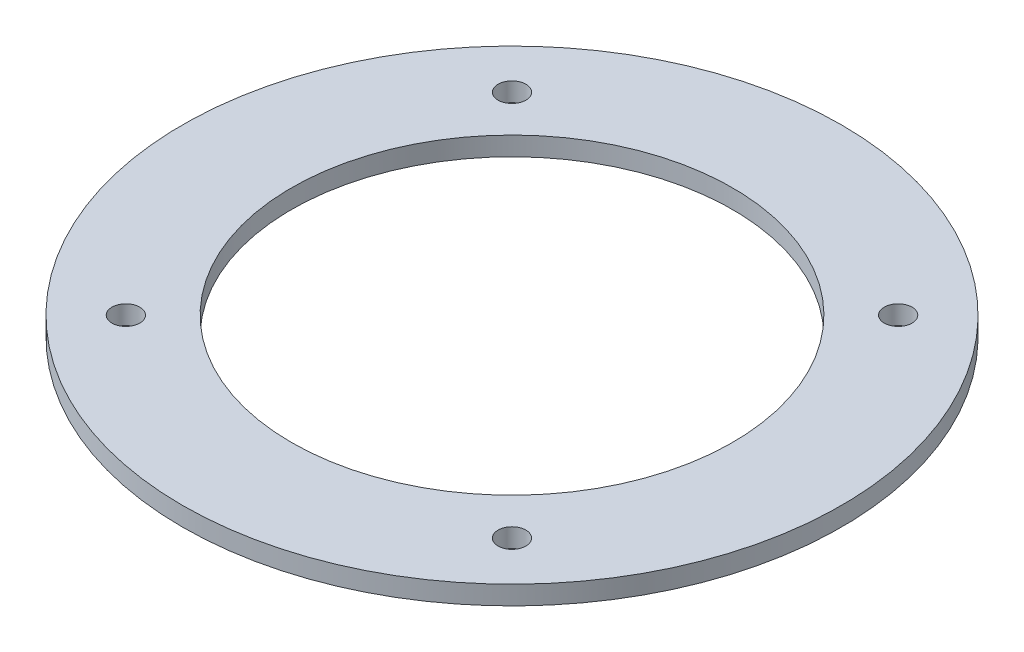
ISO-10303-21;
HEADER;
FILE_DESCRIPTION(('STEP AP214'),'2;1');
FILE_NAME('part.step','',(''),(''),'','','');
FILE_SCHEMA(('AUTOMOTIVE_DESIGN { 1 0 10303 214 1 1 1 1 }'));
ENDSEC;
DATA;
#1=APPLICATION_CONTEXT('core data for automotive mechanical design processes');
#2=APPLICATION_PROTOCOL_DEFINITION('international standard','automotive_design',2000,#1);
#3=PRODUCT_CONTEXT('',#1,'mechanical');
#4=PRODUCT('Part','Part','',(#3));
#5=PRODUCT_RELATED_PRODUCT_CATEGORY('part','',(#4));
#6=PRODUCT_DEFINITION_FORMATION('','',#4);
#7=PRODUCT_DEFINITION_CONTEXT('part definition',#1,'design');
#8=PRODUCT_DEFINITION('design','',#6,#7);
#9=PRODUCT_DEFINITION_SHAPE('','',#8);
#10=(LENGTH_UNIT() NAMED_UNIT(*) SI_UNIT(.MILLI.,.METRE.));
#11=(NAMED_UNIT(*) PLANE_ANGLE_UNIT() SI_UNIT($,.RADIAN.));
#12=(NAMED_UNIT(*) SI_UNIT($,.STERADIAN.) SOLID_ANGLE_UNIT());
#13=UNCERTAINTY_MEASURE_WITH_UNIT(LENGTH_MEASURE(1.E-05),#10,'distance_accuracy_value','');
#14=(GEOMETRIC_REPRESENTATION_CONTEXT(3) GLOBAL_UNCERTAINTY_ASSIGNED_CONTEXT((#13)) GLOBAL_UNIT_ASSIGNED_CONTEXT((#10,
#11,#12)) REPRESENTATION_CONTEXT('',''));
#15=CARTESIAN_POINT('',(0.,0.,0.));
#16=DIRECTION('',(0.,0.,1.));
#17=DIRECTION('',(1.,0.,0.));
#18=AXIS2_PLACEMENT_3D('',#15,#16,#17);
#19=CARTESIAN_POINT('',(0.,1.,0.));
#20=DIRECTION('',(0.,1.,0.));
#21=DIRECTION('',(0.,0.,1.));
#22=AXIS2_PLACEMENT_3D('',#19,#20,#21);
#23=PLANE('',#22);
#24=CARTESIAN_POINT('',(20.505,1.,20.505));
#25=DIRECTION('',(0.,1.,0.));
#26=DIRECTION('',(0.,0.,1.));
#27=AXIS2_PLACEMENT_3D('',#24,#25,#26);
#28=CIRCLE('',#27,1.475);
#29=CARTESIAN_POINT('',(20.505,1.,21.98));
#30=VERTEX_POINT('',#29);
#31=EDGE_CURVE('E64',#30,#30,#28,.T.);
#32=ORIENTED_EDGE('',*,*,#31,.F.);
#33=EDGE_LOOP('',(#32));
#34=FACE_BOUND('',#33,.T.);
#35=CARTESIAN_POINT('',(-20.505,1.,-20.505));
#36=DIRECTION('',(0.,1.,0.));
#37=DIRECTION('',(0.,0.,1.));
#38=AXIS2_PLACEMENT_3D('',#35,#36,#37);
#39=CIRCLE('',#38,1.475);
#40=CARTESIAN_POINT('',(-20.505,1.,-19.03));
#41=VERTEX_POINT('',#40);
#42=EDGE_CURVE('E52',#41,#41,#39,.T.);
#43=ORIENTED_EDGE('',*,*,#42,.F.);
#44=EDGE_LOOP('',(#43));
#45=FACE_BOUND('',#44,.T.);
#46=CARTESIAN_POINT('',(0.,1.,0.));
#47=DIRECTION('',(0.,1.,0.));
#48=DIRECTION('',(0.,0.,1.));
#49=AXIS2_PLACEMENT_3D('',#46,#47,#48);
#50=CIRCLE('',#49,35.);
#51=CARTESIAN_POINT('',(0.,1.,35.));
#52=VERTEX_POINT('',#51);
#53=EDGE_CURVE('E10',#52,#52,#50,.T.);
#54=ORIENTED_EDGE('',*,*,#53,.T.);
#55=EDGE_LOOP('',(#54));
#56=FACE_BOUND('',#55,.T.);
#57=CARTESIAN_POINT('',(0.,1.,0.));
#58=DIRECTION('',(0.,1.,0.));
#59=DIRECTION('',(0.,0.,1.));
#60=AXIS2_PLACEMENT_3D('',#57,#58,#59);
#61=CIRCLE('',#60,23.425);
#62=CARTESIAN_POINT('',(0.,1.,23.425));
#63=VERTEX_POINT('',#62);
#64=EDGE_CURVE('E47',#63,#63,#61,.T.);
#65=ORIENTED_EDGE('',*,*,#64,.F.);
#66=EDGE_LOOP('',(#65));
#67=FACE_BOUND('',#66,.T.);
#68=CARTESIAN_POINT('',(20.505,1.,-20.505));
#69=DIRECTION('',(0.,1.,0.));
#70=DIRECTION('',(0.,0.,-1.));
#71=AXIS2_PLACEMENT_3D('',#68,#69,#70);
#72=CIRCLE('',#71,1.475);
#73=CARTESIAN_POINT('',(20.505,1.,-21.98));
#74=VERTEX_POINT('',#73);
#75=EDGE_CURVE('E58',#74,#74,#72,.T.);
#76=ORIENTED_EDGE('',*,*,#75,.F.);
#77=EDGE_LOOP('',(#76));
#78=FACE_BOUND('',#77,.T.);
#79=CARTESIAN_POINT('',(-20.505,1.,20.505));
#80=DIRECTION('',(0.,1.,0.));
#81=DIRECTION('',(0.,0.,-1.));
#82=AXIS2_PLACEMENT_3D('',#79,#80,#81);
#83=CIRCLE('',#82,1.475);
#84=CARTESIAN_POINT('',(-20.505,1.,19.03));
#85=VERTEX_POINT('',#84);
#86=EDGE_CURVE('E70',#85,#85,#83,.T.);
#87=ORIENTED_EDGE('',*,*,#86,.F.);
#88=EDGE_LOOP('',(#87));
#89=FACE_BOUND('',#88,.T.);
#90=ADVANCED_FACE('F36',(#34,#45,#56,#67,#78,#89),#23,.T.);
#91=CARTESIAN_POINT('',(0.,-1.,0.));
#92=DIRECTION('',(0.,1.,0.));
#93=DIRECTION('',(0.,0.,1.));
#94=AXIS2_PLACEMENT_3D('',#91,#92,#93);
#95=PLANE('',#94);
#96=CARTESIAN_POINT('',(0.,-1.,0.));
#97=DIRECTION('',(0.,1.,0.));
#98=DIRECTION('',(0.,0.,1.));
#99=AXIS2_PLACEMENT_3D('',#96,#97,#98);
#100=CIRCLE('',#99,35.);
#101=CARTESIAN_POINT('',(0.,-1.,35.));
#102=VERTEX_POINT('',#101);
#103=EDGE_CURVE('E40',#102,#102,#100,.T.);
#104=ORIENTED_EDGE('',*,*,#103,.F.);
#105=EDGE_LOOP('',(#104));
#106=FACE_BOUND('',#105,.T.);
#107=CARTESIAN_POINT('',(0.,-1.,0.));
#108=DIRECTION('',(0.,1.,0.));
#109=DIRECTION('',(0.,0.,1.));
#110=AXIS2_PLACEMENT_3D('',#107,#108,#109);
#111=CIRCLE('',#110,23.425);
#112=CARTESIAN_POINT('',(0.,-1.,23.425));
#113=VERTEX_POINT('',#112);
#114=EDGE_CURVE('E49',#113,#113,#111,.T.);
#115=ORIENTED_EDGE('',*,*,#114,.T.);
#116=EDGE_LOOP('',(#115));
#117=FACE_BOUND('',#116,.T.);
#118=CARTESIAN_POINT('',(-20.505,-1.,-20.505));
#119=DIRECTION('',(0.,1.,0.));
#120=DIRECTION('',(0.,0.,1.));
#121=AXIS2_PLACEMENT_3D('',#118,#119,#120);
#122=CIRCLE('',#121,1.475);
#123=CARTESIAN_POINT('',(-20.505,-1.,-19.03));
#124=VERTEX_POINT('',#123);
#125=EDGE_CURVE('E55',#124,#124,#122,.T.);
#126=ORIENTED_EDGE('',*,*,#125,.T.);
#127=EDGE_LOOP('',(#126));
#128=FACE_BOUND('',#127,.T.);
#129=CARTESIAN_POINT('',(20.505,-1.,-20.505));
#130=DIRECTION('',(0.,1.,0.));
#131=DIRECTION('',(0.,0.,-1.));
#132=AXIS2_PLACEMENT_3D('',#129,#130,#131);
#133=CIRCLE('',#132,1.475);
#134=CARTESIAN_POINT('',(20.505,-1.,-21.98));
#135=VERTEX_POINT('',#134);
#136=EDGE_CURVE('E61',#135,#135,#133,.T.);
#137=ORIENTED_EDGE('',*,*,#136,.T.);
#138=EDGE_LOOP('',(#137));
#139=FACE_BOUND('',#138,.T.);
#140=CARTESIAN_POINT('',(20.505,-1.,20.505));
#141=DIRECTION('',(0.,1.,0.));
#142=DIRECTION('',(0.,0.,1.));
#143=AXIS2_PLACEMENT_3D('',#140,#141,#142);
#144=CIRCLE('',#143,1.475);
#145=CARTESIAN_POINT('',(20.505,-1.,21.98));
#146=VERTEX_POINT('',#145);
#147=EDGE_CURVE('E67',#146,#146,#144,.T.);
#148=ORIENTED_EDGE('',*,*,#147,.T.);
#149=EDGE_LOOP('',(#148));
#150=FACE_BOUND('',#149,.T.);
#151=CARTESIAN_POINT('',(-20.505,-1.,20.505));
#152=DIRECTION('',(0.,1.,0.));
#153=DIRECTION('',(0.,0.,-1.));
#154=AXIS2_PLACEMENT_3D('',#151,#152,#153);
#155=CIRCLE('',#154,1.475);
#156=CARTESIAN_POINT('',(-20.505,-1.,19.03));
#157=VERTEX_POINT('',#156);
#158=EDGE_CURVE('E73',#157,#157,#155,.T.);
#159=ORIENTED_EDGE('',*,*,#158,.T.);
#160=EDGE_LOOP('',(#159));
#161=FACE_BOUND('',#160,.T.);
#162=ADVANCED_FACE('F83',(#106,#117,#128,#139,#150,#161),#95,.F.);
#163=CARTESIAN_POINT('',(0.,1.,0.));
#164=DIRECTION('',(0.,-1.,0.));
#165=DIRECTION('',(0.,0.,-1.));
#166=AXIS2_PLACEMENT_3D('',#163,#164,#165);
#167=CYLINDRICAL_SURFACE('',#166,35.);
#168=ORIENTED_EDGE('',*,*,#53,.F.);
#169=EDGE_LOOP('',(#168));
#170=FACE_BOUND('',#169,.T.);
#171=ORIENTED_EDGE('',*,*,#103,.T.);
#172=EDGE_LOOP('',(#171));
#173=FACE_BOUND('',#172,.T.);
#174=ADVANCED_FACE('F38',(#170,#173),#167,.T.);
#175=CARTESIAN_POINT('',(0.,1.,0.));
#176=DIRECTION('',(0.,-1.,0.));
#177=DIRECTION('',(0.,0.,-1.));
#178=AXIS2_PLACEMENT_3D('',#175,#176,#177);
#179=CYLINDRICAL_SURFACE('',#178,23.425);
#180=ORIENTED_EDGE('',*,*,#64,.T.);
#181=EDGE_LOOP('',(#180));
#182=FACE_BOUND('',#181,.T.);
#183=ORIENTED_EDGE('',*,*,#114,.F.);
#184=EDGE_LOOP('',(#183));
#185=FACE_BOUND('',#184,.T.);
#186=ADVANCED_FACE('F93',(#182,#185),#179,.F.);
#187=CARTESIAN_POINT('',(-20.505,1.,-20.505));
#188=DIRECTION('',(0.,-1.,0.));
#189=DIRECTION('',(0.,0.,-1.));
#190=AXIS2_PLACEMENT_3D('',#187,#188,#189);
#191=CYLINDRICAL_SURFACE('',#190,1.475);
#192=ORIENTED_EDGE('',*,*,#42,.T.);
#193=EDGE_LOOP('',(#192));
#194=FACE_BOUND('',#193,.T.);
#195=ORIENTED_EDGE('',*,*,#125,.F.);
#196=EDGE_LOOP('',(#195));
#197=FACE_BOUND('',#196,.T.);
#198=ADVANCED_FACE('F96',(#194,#197),#191,.F.);
#199=CARTESIAN_POINT('',(20.505,1.,-20.505));
#200=DIRECTION('',(0.,-1.,0.));
#201=DIRECTION('',(0.,0.,-1.));
#202=AXIS2_PLACEMENT_3D('',#199,#200,#201);
#203=CYLINDRICAL_SURFACE('',#202,1.475);
#204=ORIENTED_EDGE('',*,*,#75,.T.);
#205=EDGE_LOOP('',(#204));
#206=FACE_BOUND('',#205,.T.);
#207=ORIENTED_EDGE('',*,*,#136,.F.);
#208=EDGE_LOOP('',(#207));
#209=FACE_BOUND('',#208,.T.);
#210=ADVANCED_FACE('F100',(#206,#209),#203,.F.);
#211=CARTESIAN_POINT('',(20.505,1.,20.505));
#212=DIRECTION('',(0.,-1.,0.));
#213=DIRECTION('',(0.,0.,-1.));
#214=AXIS2_PLACEMENT_3D('',#211,#212,#213);
#215=CYLINDRICAL_SURFACE('',#214,1.475);
#216=ORIENTED_EDGE('',*,*,#31,.T.);
#217=EDGE_LOOP('',(#216));
#218=FACE_BOUND('',#217,.T.);
#219=ORIENTED_EDGE('',*,*,#147,.F.);
#220=EDGE_LOOP('',(#219));
#221=FACE_BOUND('',#220,.T.);
#222=ADVANCED_FACE('F104',(#218,#221),#215,.F.);
#223=CARTESIAN_POINT('',(-20.505,1.,20.505));
#224=DIRECTION('',(0.,-1.,0.));
#225=DIRECTION('',(0.,0.,-1.));
#226=AXIS2_PLACEMENT_3D('',#223,#224,#225);
#227=CYLINDRICAL_SURFACE('',#226,1.475);
#228=ORIENTED_EDGE('',*,*,#86,.T.);
#229=EDGE_LOOP('',(#228));
#230=FACE_BOUND('',#229,.T.);
#231=ORIENTED_EDGE('',*,*,#158,.F.);
#232=EDGE_LOOP('',(#231));
#233=FACE_BOUND('',#232,.T.);
#234=ADVANCED_FACE('F79',(#230,#233),#227,.F.);
#235=CLOSED_SHELL('',(#90,#162,#174,#186,#198,#210,#222,#234));
#236=MANIFOLD_SOLID_BREP('B2',#235);
#237=ADVANCED_BREP_SHAPE_REPRESENTATION('',(#18,#236),#14);
#238=SHAPE_DEFINITION_REPRESENTATION(#9,#237);
ENDSEC;
END-ISO-10303-21;
